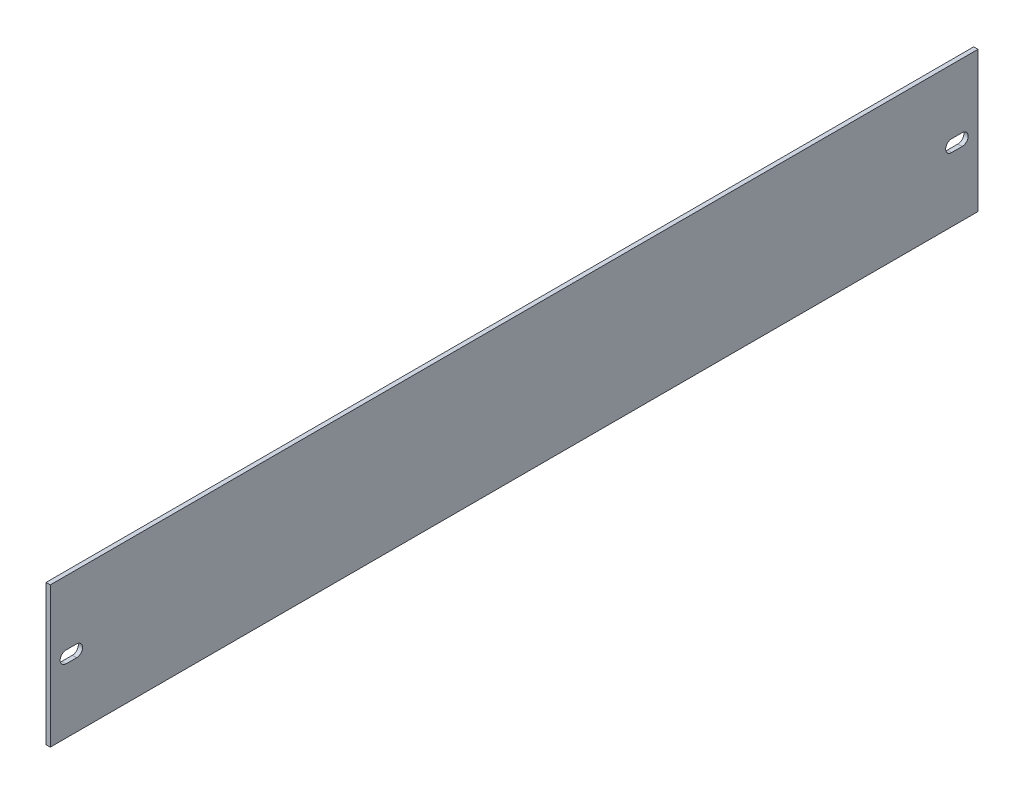
ISO-10303-21;
HEADER;
FILE_DESCRIPTION(('STEP AP214'),'2;1');
FILE_NAME('part.step','',(''),(''),'','','');
FILE_SCHEMA(('AUTOMOTIVE_DESIGN { 1 0 10303 214 1 1 1 1 }'));
ENDSEC;
DATA;
#1=APPLICATION_CONTEXT('core data for automotive mechanical design processes');
#2=APPLICATION_PROTOCOL_DEFINITION('international standard','automotive_design',2000,#1);
#3=PRODUCT_CONTEXT('',#1,'mechanical');
#4=PRODUCT('Part','Part','',(#3));
#5=PRODUCT_RELATED_PRODUCT_CATEGORY('part','',(#4));
#6=PRODUCT_DEFINITION_FORMATION('','',#4);
#7=PRODUCT_DEFINITION_CONTEXT('part definition',#1,'design');
#8=PRODUCT_DEFINITION('design','',#6,#7);
#9=PRODUCT_DEFINITION_SHAPE('','',#8);
#10=(LENGTH_UNIT() NAMED_UNIT(*) SI_UNIT(.MILLI.,.METRE.));
#11=(NAMED_UNIT(*) PLANE_ANGLE_UNIT() SI_UNIT($,.RADIAN.));
#12=(NAMED_UNIT(*) SI_UNIT($,.STERADIAN.) SOLID_ANGLE_UNIT());
#13=UNCERTAINTY_MEASURE_WITH_UNIT(LENGTH_MEASURE(1.E-05),#10,'distance_accuracy_value','');
#14=(GEOMETRIC_REPRESENTATION_CONTEXT(3) GLOBAL_UNCERTAINTY_ASSIGNED_CONTEXT((#13)) GLOBAL_UNIT_ASSIGNED_CONTEXT((#10,
#11,#12)) REPRESENTATION_CONTEXT('',''));
#15=CARTESIAN_POINT('',(0.,0.,0.));
#16=DIRECTION('',(0.,0.,1.));
#17=DIRECTION('',(1.,0.,0.));
#18=AXIS2_PLACEMENT_3D('',#15,#16,#17);
#19=CARTESIAN_POINT('',(-3.03784,0.,0.));
#20=DIRECTION('',(1.,0.,0.));
#21=DIRECTION('',(0.,0.,-1.));
#22=AXIS2_PLACEMENT_3D('',#19,#20,#21);
#23=PLANE('',#22);
#24=DIRECTION('',(0.,0.,1.));
#25=VECTOR('',#24,1.);
#26=CARTESIAN_POINT('',(-3.03784,45.75,311.25));
#27=LINE('',#26,#25);
#28=CARTESIAN_POINT('',(-3.03784,45.75,311.25));
#29=VERTEX_POINT('',#28);
#30=CARTESIAN_POINT('',(-3.03784,45.75,318.75));
#31=VERTEX_POINT('',#30);
#32=EDGE_CURVE('E281',#29,#31,#27,.T.);
#33=ORIENTED_EDGE('',*,*,#32,.F.);
#34=CARTESIAN_POINT('',(-3.03784,50.,311.25));
#35=DIRECTION('',(1.,0.,0.));
#36=DIRECTION('',(0.,0.,-1.));
#37=AXIS2_PLACEMENT_3D('',#34,#35,#36);
#38=CIRCLE('',#37,4.25);
#39=CARTESIAN_POINT('',(-3.03784,54.25,311.25));
#40=VERTEX_POINT('',#39);
#41=EDGE_CURVE('E288',#29,#40,#38,.T.);
#42=ORIENTED_EDGE('',*,*,#41,.T.);
#43=DIRECTION('',(0.,0.,1.));
#44=VECTOR('',#43,1.);
#45=CARTESIAN_POINT('',(-3.03784,54.25,311.25));
#46=LINE('',#45,#44);
#47=CARTESIAN_POINT('',(-3.03784,54.25,318.75));
#48=VERTEX_POINT('',#47);
#49=EDGE_CURVE('E273',#40,#48,#46,.T.);
#50=ORIENTED_EDGE('',*,*,#49,.T.);
#51=CARTESIAN_POINT('',(-3.03784,50.,318.75));
#52=DIRECTION('',(1.,0.,0.));
#53=DIRECTION('',(0.,0.,-1.));
#54=AXIS2_PLACEMENT_3D('',#51,#52,#53);
#55=CIRCLE('',#54,4.25);
#56=EDGE_CURVE('E303',#48,#31,#55,.T.);
#57=ORIENTED_EDGE('',*,*,#56,.T.);
#58=EDGE_LOOP('',(#33,#42,#50,#57));
#59=FACE_BOUND('',#58,.T.);
#60=DIRECTION('',(0.,-1.,0.));
#61=VECTOR('',#60,1.);
#62=CARTESIAN_POINT('',(-3.03784,100.,330.));
#63=LINE('',#62,#61);
#64=CARTESIAN_POINT('',(-3.03784,100.,330.));
#65=VERTEX_POINT('',#64);
#66=CARTESIAN_POINT('',(-3.03784,0.,330.));
#67=VERTEX_POINT('',#66);
#68=EDGE_CURVE('E337',#65,#67,#63,.T.);
#69=ORIENTED_EDGE('',*,*,#68,.F.);
#70=DIRECTION('',(0.,0.,1.));
#71=VECTOR('',#70,1.);
#72=CARTESIAN_POINT('',(-3.03784,100.,330.));
#73=LINE('',#72,#71);
#74=CARTESIAN_POINT('',(-3.03784,100.,-330.));
#75=VERTEX_POINT('',#74);
#76=EDGE_CURVE('E347',#75,#65,#73,.T.);
#77=ORIENTED_EDGE('',*,*,#76,.F.);
#78=DIRECTION('',(0.,1.,0.));
#79=VECTOR('',#78,1.);
#80=CARTESIAN_POINT('',(-3.03784,100.,-330.));
#81=LINE('',#80,#79);
#82=CARTESIAN_POINT('',(-3.03784,0.,-330.));
#83=VERTEX_POINT('',#82);
#84=EDGE_CURVE('E344',#83,#75,#81,.T.);
#85=ORIENTED_EDGE('',*,*,#84,.F.);
#86=DIRECTION('',(0.,0.,-1.));
#87=VECTOR('',#86,1.);
#88=CARTESIAN_POINT('',(-3.03784,0.,330.));
#89=LINE('',#88,#87);
#90=EDGE_CURVE('E340',#67,#83,#89,.T.);
#91=ORIENTED_EDGE('',*,*,#90,.F.);
#92=EDGE_LOOP('',(#69,#77,#85,#91));
#93=FACE_BOUND('',#92,.T.);
#94=DIRECTION('',(0.,0.,1.));
#95=VECTOR('',#94,1.);
#96=CARTESIAN_POINT('',(-3.03784,45.75,-318.75));
#97=LINE('',#96,#95);
#98=CARTESIAN_POINT('',(-3.03784,45.75,-318.75));
#99=VERTEX_POINT('',#98);
#100=CARTESIAN_POINT('',(-3.03784,45.75,-311.25));
#101=VERTEX_POINT('',#100);
#102=EDGE_CURVE('E311',#99,#101,#97,.T.);
#103=ORIENTED_EDGE('',*,*,#102,.F.);
#104=CARTESIAN_POINT('',(-3.03784,50.,-318.75));
#105=DIRECTION('',(1.,0.,0.));
#106=DIRECTION('',(0.,0.,-1.));
#107=AXIS2_PLACEMENT_3D('',#104,#105,#106);
#108=CIRCLE('',#107,4.25);
#109=CARTESIAN_POINT('',(-3.03784,54.25,-318.75));
#110=VERTEX_POINT('',#109);
#111=EDGE_CURVE('E321',#99,#110,#108,.T.);
#112=ORIENTED_EDGE('',*,*,#111,.T.);
#113=DIRECTION('',(0.,0.,1.));
#114=VECTOR('',#113,1.);
#115=CARTESIAN_POINT('',(-3.03784,54.25,-318.75));
#116=LINE('',#115,#114);
#117=CARTESIAN_POINT('',(-3.03784,54.25,-311.25));
#118=VERTEX_POINT('',#117);
#119=EDGE_CURVE('E308',#110,#118,#116,.T.);
#120=ORIENTED_EDGE('',*,*,#119,.T.);
#121=CARTESIAN_POINT('',(-3.03784,50.,-311.25));
#122=DIRECTION('',(1.,0.,0.));
#123=DIRECTION('',(0.,0.,-1.));
#124=AXIS2_PLACEMENT_3D('',#121,#122,#123);
#125=CIRCLE('',#124,4.25);
#126=EDGE_CURVE('E331',#118,#101,#125,.T.);
#127=ORIENTED_EDGE('',*,*,#126,.T.);
#128=EDGE_LOOP('',(#103,#112,#120,#127));
#129=FACE_BOUND('',#128,.T.);
#130=ADVANCED_FACE('F184',(#59,#93,#129),#23,.F.);
#131=CARTESIAN_POINT('',(-3.03784,100.,330.));
#132=DIRECTION('',(0.,0.,1.));
#133=DIRECTION('',(1.,0.,0.));
#134=AXIS2_PLACEMENT_3D('',#131,#132,#133);
#135=PLANE('',#134);
#136=DIRECTION('',(0.,-1.,0.));
#137=VECTOR('',#136,1.);
#138=CARTESIAN_POINT('',(0.,100.,330.));
#139=LINE('',#138,#137);
#140=CARTESIAN_POINT('',(0.,100.,330.));
#141=VERTEX_POINT('',#140);
#142=CARTESIAN_POINT('',(0.,0.,330.));
#143=VERTEX_POINT('',#142);
#144=EDGE_CURVE('E336',#141,#143,#139,.T.);
#145=ORIENTED_EDGE('',*,*,#144,.F.);
#146=DIRECTION('',(1.,0.,0.));
#147=VECTOR('',#146,1.);
#148=CARTESIAN_POINT('',(-3.03784,100.,330.));
#149=LINE('',#148,#147);
#150=EDGE_CURVE('E13',#65,#141,#149,.T.);
#151=ORIENTED_EDGE('',*,*,#150,.F.);
#152=ORIENTED_EDGE('',*,*,#68,.T.);
#153=DIRECTION('',(1.,0.,0.));
#154=VECTOR('',#153,1.);
#155=CARTESIAN_POINT('',(-3.03784,0.,330.));
#156=LINE('',#155,#154);
#157=EDGE_CURVE('E188',#67,#143,#156,.T.);
#158=ORIENTED_EDGE('',*,*,#157,.T.);
#159=EDGE_LOOP('',(#145,#151,#152,#158));
#160=FACE_BOUND('',#159,.T.);
#161=ADVANCED_FACE('F186',(#160),#135,.T.);
#162=CARTESIAN_POINT('',(-3.03784,100.,330.));
#163=DIRECTION('',(0.,1.,0.));
#164=DIRECTION('',(0.,0.,1.));
#165=AXIS2_PLACEMENT_3D('',#162,#163,#164);
#166=PLANE('',#165);
#167=DIRECTION('',(0.,0.,1.));
#168=VECTOR('',#167,1.);
#169=CARTESIAN_POINT('',(0.,100.,330.));
#170=LINE('',#169,#168);
#171=CARTESIAN_POINT('',(0.,100.,-330.));
#172=VERTEX_POINT('',#171);
#173=EDGE_CURVE('E341',#172,#141,#170,.T.);
#174=ORIENTED_EDGE('',*,*,#173,.F.);
#175=DIRECTION('',(1.,0.,0.));
#176=VECTOR('',#175,1.);
#177=CARTESIAN_POINT('',(-3.03784,100.,-330.));
#178=LINE('',#177,#176);
#179=EDGE_CURVE('E193',#75,#172,#178,.T.);
#180=ORIENTED_EDGE('',*,*,#179,.F.);
#181=ORIENTED_EDGE('',*,*,#76,.T.);
#182=ORIENTED_EDGE('',*,*,#150,.T.);
#183=EDGE_LOOP('',(#174,#180,#181,#182));
#184=FACE_BOUND('',#183,.T.);
#185=ADVANCED_FACE('F373',(#184),#166,.T.);
#186=CARTESIAN_POINT('',(-3.03784,100.,-330.));
#187=DIRECTION('',(0.,0.,-1.));
#188=DIRECTION('',(-1.,0.,0.));
#189=AXIS2_PLACEMENT_3D('',#186,#187,#188);
#190=PLANE('',#189);
#191=DIRECTION('',(0.,1.,0.));
#192=VECTOR('',#191,1.);
#193=CARTESIAN_POINT('',(0.,100.,-330.));
#194=LINE('',#193,#192);
#195=CARTESIAN_POINT('',(0.,0.,-330.));
#196=VERTEX_POINT('',#195);
#197=EDGE_CURVE('E355',#196,#172,#194,.T.);
#198=ORIENTED_EDGE('',*,*,#197,.F.);
#199=DIRECTION('',(1.,0.,0.));
#200=VECTOR('',#199,1.);
#201=CARTESIAN_POINT('',(-3.03784,0.,-330.));
#202=LINE('',#201,#200);
#203=EDGE_CURVE('E360',#83,#196,#202,.T.);
#204=ORIENTED_EDGE('',*,*,#203,.F.);
#205=ORIENTED_EDGE('',*,*,#84,.T.);
#206=ORIENTED_EDGE('',*,*,#179,.T.);
#207=EDGE_LOOP('',(#198,#204,#205,#206));
#208=FACE_BOUND('',#207,.T.);
#209=ADVANCED_FACE('F378',(#208),#190,.T.);
#210=CARTESIAN_POINT('',(-3.03784,0.,330.));
#211=DIRECTION('',(0.,-1.,0.));
#212=DIRECTION('',(0.,0.,-1.));
#213=AXIS2_PLACEMENT_3D('',#210,#211,#212);
#214=PLANE('',#213);
#215=DIRECTION('',(0.,0.,-1.));
#216=VECTOR('',#215,1.);
#217=CARTESIAN_POINT('',(0.,0.,330.));
#218=LINE('',#217,#216);
#219=EDGE_CURVE('E352',#143,#196,#218,.T.);
#220=ORIENTED_EDGE('',*,*,#219,.F.);
#221=ORIENTED_EDGE('',*,*,#157,.F.);
#222=ORIENTED_EDGE('',*,*,#90,.T.);
#223=ORIENTED_EDGE('',*,*,#203,.T.);
#224=EDGE_LOOP('',(#220,#221,#222,#223));
#225=FACE_BOUND('',#224,.T.);
#226=ADVANCED_FACE('F368',(#225),#214,.T.);
#227=CARTESIAN_POINT('',(0.,0.,0.));
#228=DIRECTION('',(1.,0.,0.));
#229=DIRECTION('',(0.,0.,-1.));
#230=AXIS2_PLACEMENT_3D('',#227,#228,#229);
#231=PLANE('',#230);
#232=CARTESIAN_POINT('',(0.,50.,311.25));
#233=DIRECTION('',(1.,0.,0.));
#234=DIRECTION('',(0.,0.,-1.));
#235=AXIS2_PLACEMENT_3D('',#232,#233,#234);
#236=CIRCLE('',#235,4.25);
#237=CARTESIAN_POINT('',(0.,45.75,311.25));
#238=VERTEX_POINT('',#237);
#239=CARTESIAN_POINT('',(0.,54.25,311.25));
#240=VERTEX_POINT('',#239);
#241=EDGE_CURVE('E291',#238,#240,#236,.T.);
#242=ORIENTED_EDGE('',*,*,#241,.F.);
#243=DIRECTION('',(0.,0.,1.));
#244=VECTOR('',#243,1.);
#245=CARTESIAN_POINT('',(0.,45.75,311.25));
#246=LINE('',#245,#244);
#247=CARTESIAN_POINT('',(0.,45.75,318.75));
#248=VERTEX_POINT('',#247);
#249=EDGE_CURVE('E292',#238,#248,#246,.T.);
#250=ORIENTED_EDGE('',*,*,#249,.T.);
#251=CARTESIAN_POINT('',(0.,50.,318.75));
#252=DIRECTION('',(1.,0.,0.));
#253=DIRECTION('',(0.,0.,-1.));
#254=AXIS2_PLACEMENT_3D('',#251,#252,#253);
#255=CIRCLE('',#254,4.25);
#256=CARTESIAN_POINT('',(0.,54.25,318.75));
#257=VERTEX_POINT('',#256);
#258=EDGE_CURVE('E301',#257,#248,#255,.T.);
#259=ORIENTED_EDGE('',*,*,#258,.F.);
#260=DIRECTION('',(0.,0.,1.));
#261=VECTOR('',#260,1.);
#262=CARTESIAN_POINT('',(0.,54.2500000000001,311.25));
#263=LINE('',#262,#261);
#264=EDGE_CURVE('E282',#240,#257,#263,.T.);
#265=ORIENTED_EDGE('',*,*,#264,.F.);
#266=EDGE_LOOP('',(#242,#250,#259,#265));
#267=FACE_BOUND('',#266,.T.);
#268=CARTESIAN_POINT('',(0.,50.,-311.25));
#269=DIRECTION('',(1.,0.,0.));
#270=DIRECTION('',(0.,0.,-1.));
#271=AXIS2_PLACEMENT_3D('',#268,#269,#270);
#272=CIRCLE('',#271,4.25);
#273=CARTESIAN_POINT('',(0.,54.2500000000001,-311.25));
#274=VERTEX_POINT('',#273);
#275=CARTESIAN_POINT('',(0.,45.75,-311.25));
#276=VERTEX_POINT('',#275);
#277=EDGE_CURVE('E328',#274,#276,#272,.T.);
#278=ORIENTED_EDGE('',*,*,#277,.F.);
#279=DIRECTION('',(0.,0.,1.));
#280=VECTOR('',#279,1.);
#281=CARTESIAN_POINT('',(0.,54.2500000000001,-318.75));
#282=LINE('',#281,#280);
#283=CARTESIAN_POINT('',(0.,54.25,-318.75));
#284=VERTEX_POINT('',#283);
#285=EDGE_CURVE('E306',#284,#274,#282,.T.);
#286=ORIENTED_EDGE('',*,*,#285,.F.);
#287=CARTESIAN_POINT('',(0.,50.,-318.75));
#288=DIRECTION('',(1.,0.,0.));
#289=DIRECTION('',(0.,0.,-1.));
#290=AXIS2_PLACEMENT_3D('',#287,#288,#289);
#291=CIRCLE('',#290,4.25);
#292=CARTESIAN_POINT('',(0.,45.75,-318.75));
#293=VERTEX_POINT('',#292);
#294=EDGE_CURVE('E319',#293,#284,#291,.T.);
#295=ORIENTED_EDGE('',*,*,#294,.F.);
#296=DIRECTION('',(0.,0.,1.));
#297=VECTOR('',#296,1.);
#298=CARTESIAN_POINT('',(0.,45.75,-318.75));
#299=LINE('',#298,#297);
#300=EDGE_CURVE('E313',#293,#276,#299,.T.);
#301=ORIENTED_EDGE('',*,*,#300,.T.);
#302=EDGE_LOOP('',(#278,#286,#295,#301));
#303=FACE_BOUND('',#302,.T.);
#304=ORIENTED_EDGE('',*,*,#144,.T.);
#305=ORIENTED_EDGE('',*,*,#219,.T.);
#306=ORIENTED_EDGE('',*,*,#197,.T.);
#307=ORIENTED_EDGE('',*,*,#173,.T.);
#308=EDGE_LOOP('',(#304,#305,#306,#307));
#309=FACE_BOUND('',#308,.T.);
#310=ADVANCED_FACE('F370',(#267,#303,#309),#231,.T.);
#311=CARTESIAN_POINT('',(0.,50.,-311.25));
#312=DIRECTION('',(1.,0.,0.));
#313=DIRECTION('',(0.,0.,-1.));
#314=AXIS2_PLACEMENT_3D('',#311,#312,#313);
#315=CYLINDRICAL_SURFACE('',#314,4.25);
#316=ORIENTED_EDGE('',*,*,#126,.F.);
#317=DIRECTION('',(-1.,0.,0.));
#318=VECTOR('',#317,1.);
#319=CARTESIAN_POINT('',(-3.03784,54.25,-311.25));
#320=LINE('',#319,#318);
#321=EDGE_CURVE('E326',#274,#118,#320,.T.);
#322=ORIENTED_EDGE('',*,*,#321,.F.);
#323=ORIENTED_EDGE('',*,*,#277,.T.);
#324=DIRECTION('',(1.,0.,0.));
#325=VECTOR('',#324,1.);
#326=CARTESIAN_POINT('',(0.,45.75,-311.25));
#327=LINE('',#326,#325);
#328=EDGE_CURVE('E334',#101,#276,#327,.T.);
#329=ORIENTED_EDGE('',*,*,#328,.F.);
#330=EDGE_LOOP('',(#316,#322,#323,#329));
#331=FACE_BOUND('',#330,.T.);
#332=ADVANCED_FACE('F393',(#331),#315,.F.);
#333=CARTESIAN_POINT('',(0.,50.,-318.75));
#334=DIRECTION('',(1.,0.,0.));
#335=DIRECTION('',(0.,0.,-1.));
#336=AXIS2_PLACEMENT_3D('',#333,#334,#335);
#337=CYLINDRICAL_SURFACE('',#336,4.25);
#338=ORIENTED_EDGE('',*,*,#294,.T.);
#339=DIRECTION('',(-1.,0.,0.));
#340=VECTOR('',#339,1.);
#341=CARTESIAN_POINT('',(-3.03784,54.25,-318.75));
#342=LINE('',#341,#340);
#343=EDGE_CURVE('E316',#284,#110,#342,.T.);
#344=ORIENTED_EDGE('',*,*,#343,.T.);
#345=ORIENTED_EDGE('',*,*,#111,.F.);
#346=DIRECTION('',(1.,0.,0.));
#347=VECTOR('',#346,1.);
#348=CARTESIAN_POINT('',(0.,45.75,-318.75));
#349=LINE('',#348,#347);
#350=EDGE_CURVE('E324',#293,#99,#349,.F.);
#351=ORIENTED_EDGE('',*,*,#350,.F.);
#352=EDGE_LOOP('',(#338,#344,#345,#351));
#353=FACE_BOUND('',#352,.T.);
#354=ADVANCED_FACE('F400',(#353),#337,.F.);
#355=CARTESIAN_POINT('',(0.,45.75,-318.75));
#356=DIRECTION('',(0.,-1.,0.));
#357=DIRECTION('',(0.,0.,-1.));
#358=AXIS2_PLACEMENT_3D('',#355,#356,#357);
#359=PLANE('',#358);
#360=ORIENTED_EDGE('',*,*,#328,.T.);
#361=ORIENTED_EDGE('',*,*,#300,.F.);
#362=ORIENTED_EDGE('',*,*,#350,.T.);
#363=ORIENTED_EDGE('',*,*,#102,.T.);
#364=EDGE_LOOP('',(#360,#361,#362,#363));
#365=FACE_BOUND('',#364,.T.);
#366=ADVANCED_FACE('F418',(#365),#359,.F.);
#367=CARTESIAN_POINT('',(-3.03784,54.25,-318.75));
#368=DIRECTION('',(0.,1.,0.));
#369=DIRECTION('',(0.,0.,1.));
#370=AXIS2_PLACEMENT_3D('',#367,#368,#369);
#371=PLANE('',#370);
#372=ORIENTED_EDGE('',*,*,#321,.T.);
#373=ORIENTED_EDGE('',*,*,#119,.F.);
#374=ORIENTED_EDGE('',*,*,#343,.F.);
#375=ORIENTED_EDGE('',*,*,#285,.T.);
#376=EDGE_LOOP('',(#372,#373,#374,#375));
#377=FACE_BOUND('',#376,.T.);
#378=ADVANCED_FACE('F412',(#377),#371,.F.);
#379=CARTESIAN_POINT('',(0.,50.,318.75));
#380=DIRECTION('',(1.,0.,0.));
#381=DIRECTION('',(0.,0.,-1.));
#382=AXIS2_PLACEMENT_3D('',#379,#380,#381);
#383=CYLINDRICAL_SURFACE('',#382,4.25);
#384=ORIENTED_EDGE('',*,*,#56,.F.);
#385=DIRECTION('',(-1.,0.,0.));
#386=VECTOR('',#385,1.);
#387=CARTESIAN_POINT('',(-3.03784,54.25,318.75));
#388=LINE('',#387,#386);
#389=EDGE_CURVE('E206',#257,#48,#388,.T.);
#390=ORIENTED_EDGE('',*,*,#389,.F.);
#391=ORIENTED_EDGE('',*,*,#258,.T.);
#392=DIRECTION('',(1.,0.,0.));
#393=VECTOR('',#392,1.);
#394=CARTESIAN_POINT('',(0.,45.75,318.75));
#395=LINE('',#394,#393);
#396=EDGE_CURVE('E201',#31,#248,#395,.T.);
#397=ORIENTED_EDGE('',*,*,#396,.F.);
#398=EDGE_LOOP('',(#384,#390,#391,#397));
#399=FACE_BOUND('',#398,.T.);
#400=ADVANCED_FACE('F425',(#399),#383,.F.);
#401=CARTESIAN_POINT('',(0.,50.,311.25));
#402=DIRECTION('',(1.,0.,0.));
#403=DIRECTION('',(0.,0.,-1.));
#404=AXIS2_PLACEMENT_3D('',#401,#402,#403);
#405=CYLINDRICAL_SURFACE('',#404,4.25);
#406=ORIENTED_EDGE('',*,*,#241,.T.);
#407=DIRECTION('',(-1.,0.,0.));
#408=VECTOR('',#407,1.);
#409=CARTESIAN_POINT('',(-3.03784,54.25,311.25));
#410=LINE('',#409,#408);
#411=EDGE_CURVE('E276',#240,#40,#410,.T.);
#412=ORIENTED_EDGE('',*,*,#411,.T.);
#413=ORIENTED_EDGE('',*,*,#41,.F.);
#414=DIRECTION('',(1.,0.,0.));
#415=VECTOR('',#414,1.);
#416=CARTESIAN_POINT('',(0.,45.75,311.25));
#417=LINE('',#416,#415);
#418=EDGE_CURVE('E295',#238,#29,#417,.F.);
#419=ORIENTED_EDGE('',*,*,#418,.F.);
#420=EDGE_LOOP('',(#406,#412,#413,#419));
#421=FACE_BOUND('',#420,.T.);
#422=ADVANCED_FACE('F286',(#421),#405,.F.);
#423=CARTESIAN_POINT('',(0.,45.75,311.25));
#424=DIRECTION('',(0.,-1.,0.));
#425=DIRECTION('',(0.,0.,-1.));
#426=AXIS2_PLACEMENT_3D('',#423,#424,#425);
#427=PLANE('',#426);
#428=ORIENTED_EDGE('',*,*,#396,.T.);
#429=ORIENTED_EDGE('',*,*,#249,.F.);
#430=ORIENTED_EDGE('',*,*,#418,.T.);
#431=ORIENTED_EDGE('',*,*,#32,.T.);
#432=EDGE_LOOP('',(#428,#429,#430,#431));
#433=FACE_BOUND('',#432,.T.);
#434=ADVANCED_FACE('F432',(#433),#427,.F.);
#435=CARTESIAN_POINT('',(-3.03784,54.25,311.25));
#436=DIRECTION('',(0.,1.,0.));
#437=DIRECTION('',(0.,0.,1.));
#438=AXIS2_PLACEMENT_3D('',#435,#436,#437);
#439=PLANE('',#438);
#440=ORIENTED_EDGE('',*,*,#389,.T.);
#441=ORIENTED_EDGE('',*,*,#49,.F.);
#442=ORIENTED_EDGE('',*,*,#411,.F.);
#443=ORIENTED_EDGE('',*,*,#264,.T.);
#444=EDGE_LOOP('',(#440,#441,#442,#443));
#445=FACE_BOUND('',#444,.T.);
#446=ADVANCED_FACE('F275',(#445),#439,.F.);
#447=CLOSED_SHELL('',(#130,#161,#185,#209,#226,#310,#332,#354,#366,#378,#400,#422,#434,#446));
#448=MANIFOLD_SOLID_BREP('B2',#447);
#449=ADVANCED_BREP_SHAPE_REPRESENTATION('',(#18,#448),#14);
#450=SHAPE_DEFINITION_REPRESENTATION(#9,#449);
ENDSEC;
END-ISO-10303-21;
